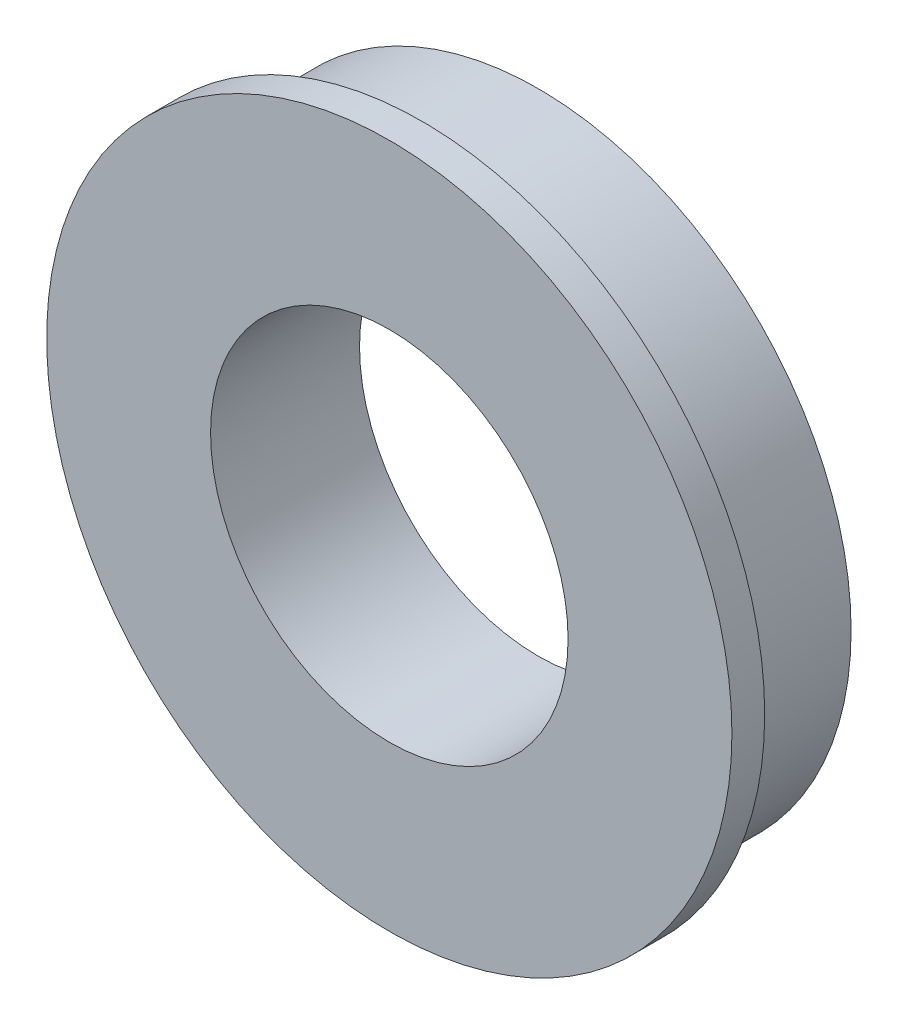
ISO-10303-21;
HEADER;
FILE_DESCRIPTION(('STEP AP214'),'2;1');
FILE_NAME('part.step','',(''),(''),'','','');
FILE_SCHEMA(('AUTOMOTIVE_DESIGN { 1 0 10303 214 1 1 1 1 }'));
ENDSEC;
DATA;
#1=APPLICATION_CONTEXT('core data for automotive mechanical design processes');
#2=APPLICATION_PROTOCOL_DEFINITION('international standard','automotive_design',2000,#1);
#3=PRODUCT_CONTEXT('',#1,'mechanical');
#4=PRODUCT('Part','Part','',(#3));
#5=PRODUCT_RELATED_PRODUCT_CATEGORY('part','',(#4));
#6=PRODUCT_DEFINITION_FORMATION('','',#4);
#7=PRODUCT_DEFINITION_CONTEXT('part definition',#1,'design');
#8=PRODUCT_DEFINITION('design','',#6,#7);
#9=PRODUCT_DEFINITION_SHAPE('','',#8);
#10=(LENGTH_UNIT() NAMED_UNIT(*) SI_UNIT(.MILLI.,.METRE.));
#11=(NAMED_UNIT(*) PLANE_ANGLE_UNIT() SI_UNIT($,.RADIAN.));
#12=(NAMED_UNIT(*) SI_UNIT($,.STERADIAN.) SOLID_ANGLE_UNIT());
#13=UNCERTAINTY_MEASURE_WITH_UNIT(LENGTH_MEASURE(1.E-05),#10,'distance_accuracy_value','');
#14=(GEOMETRIC_REPRESENTATION_CONTEXT(3) GLOBAL_UNCERTAINTY_ASSIGNED_CONTEXT((#13)) GLOBAL_UNIT_ASSIGNED_CONTEXT((#10,
#11,#12)) REPRESENTATION_CONTEXT('',''));
#15=CARTESIAN_POINT('',(0.,0.,0.));
#16=DIRECTION('',(0.,0.,1.));
#17=DIRECTION('',(1.,0.,0.));
#18=AXIS2_PLACEMENT_3D('',#15,#16,#17);
#19=CARTESIAN_POINT('',(0.,11.5,0.));
#20=DIRECTION('',(0.,0.,-1.));
#21=DIRECTION('',(-1.,0.,0.));
#22=AXIS2_PLACEMENT_3D('',#19,#20,#21);
#23=PLANE('',#22);
#24=CARTESIAN_POINT('',(0.,0.,0.));
#25=DIRECTION('',(0.,0.,1.));
#26=DIRECTION('',(1.,0.,0.));
#27=AXIS2_PLACEMENT_3D('',#24,#25,#26);
#28=CIRCLE('',#27,6.);
#29=CARTESIAN_POINT('',(6.,0.,0.));
#30=VERTEX_POINT('',#29);
#31=EDGE_CURVE('E10',#30,#30,#28,.T.);
#32=ORIENTED_EDGE('',*,*,#31,.F.);
#33=EDGE_LOOP('',(#32));
#34=FACE_BOUND('',#33,.T.);
#35=CARTESIAN_POINT('',(0.,0.,0.));
#36=DIRECTION('',(0.,0.,1.));
#37=DIRECTION('',(1.,0.,0.));
#38=AXIS2_PLACEMENT_3D('',#35,#36,#37);
#39=CIRCLE('',#38,11.5);
#40=CARTESIAN_POINT('',(11.5,0.,0.));
#41=VERTEX_POINT('',#40);
#42=EDGE_CURVE('E54',#41,#41,#39,.T.);
#43=ORIENTED_EDGE('',*,*,#42,.T.);
#44=EDGE_LOOP('',(#43));
#45=FACE_BOUND('',#44,.T.);
#46=ADVANCED_FACE('F32',(#34,#45),#23,.F.);
#47=CARTESIAN_POINT('',(0.,0.,0.));
#48=DIRECTION('',(0.,0.,1.));
#49=DIRECTION('',(1.,0.,0.));
#50=AXIS2_PLACEMENT_3D('',#47,#48,#49);
#51=CYLINDRICAL_SURFACE('',#50,6.);
#52=CARTESIAN_POINT('',(0.,0.,-5.));
#53=DIRECTION('',(0.,0.,1.));
#54=DIRECTION('',(1.,0.,0.));
#55=AXIS2_PLACEMENT_3D('',#52,#53,#54);
#56=CIRCLE('',#55,6.);
#57=CARTESIAN_POINT('',(6.,0.,-5.));
#58=VERTEX_POINT('',#57);
#59=EDGE_CURVE('E38',#58,#58,#56,.T.);
#60=ORIENTED_EDGE('',*,*,#59,.F.);
#61=EDGE_LOOP('',(#60));
#62=FACE_BOUND('',#61,.T.);
#63=ORIENTED_EDGE('',*,*,#31,.T.);
#64=EDGE_LOOP('',(#63));
#65=FACE_BOUND('',#64,.T.);
#66=ADVANCED_FACE('F79',(#62,#65),#51,.F.);
#67=CARTESIAN_POINT('',(0.,6.,-5.));
#68=DIRECTION('',(0.,0.,1.));
#69=DIRECTION('',(1.,0.,0.));
#70=AXIS2_PLACEMENT_3D('',#67,#68,#69);
#71=PLANE('',#70);
#72=CARTESIAN_POINT('',(0.,0.,-5.));
#73=DIRECTION('',(0.,0.,1.));
#74=DIRECTION('',(1.,0.,0.));
#75=AXIS2_PLACEMENT_3D('',#72,#73,#74);
#76=CIRCLE('',#75,10.5);
#77=CARTESIAN_POINT('',(10.5,0.,-5.));
#78=VERTEX_POINT('',#77);
#79=EDGE_CURVE('E42',#78,#78,#76,.T.);
#80=ORIENTED_EDGE('',*,*,#79,.F.);
#81=EDGE_LOOP('',(#80));
#82=FACE_BOUND('',#81,.T.);
#83=ORIENTED_EDGE('',*,*,#59,.T.);
#84=EDGE_LOOP('',(#83));
#85=FACE_BOUND('',#84,.T.);
#86=ADVANCED_FACE('F74',(#82,#85),#71,.F.);
#87=CARTESIAN_POINT('',(0.,0.,0.));
#88=DIRECTION('',(0.,0.,1.));
#89=DIRECTION('',(1.,0.,0.));
#90=AXIS2_PLACEMENT_3D('',#87,#88,#89);
#91=CYLINDRICAL_SURFACE('',#90,10.5);
#92=CARTESIAN_POINT('',(0.,0.,-1.1));
#93=DIRECTION('',(0.,0.,1.));
#94=DIRECTION('',(1.,0.,0.));
#95=AXIS2_PLACEMENT_3D('',#92,#93,#94);
#96=CIRCLE('',#95,10.5);
#97=CARTESIAN_POINT('',(10.5,0.,-1.1));
#98=VERTEX_POINT('',#97);
#99=EDGE_CURVE('E46',#98,#98,#96,.T.);
#100=ORIENTED_EDGE('',*,*,#99,.F.);
#101=EDGE_LOOP('',(#100));
#102=FACE_BOUND('',#101,.T.);
#103=ORIENTED_EDGE('',*,*,#79,.T.);
#104=EDGE_LOOP('',(#103));
#105=FACE_BOUND('',#104,.T.);
#106=ADVANCED_FACE('F68',(#102,#105),#91,.T.);
#107=CARTESIAN_POINT('',(0.,10.5,-1.1));
#108=DIRECTION('',(0.,0.,1.));
#109=DIRECTION('',(1.,0.,0.));
#110=AXIS2_PLACEMENT_3D('',#107,#108,#109);
#111=PLANE('',#110);
#112=CARTESIAN_POINT('',(0.,0.,-1.1));
#113=DIRECTION('',(0.,0.,1.));
#114=DIRECTION('',(1.,0.,0.));
#115=AXIS2_PLACEMENT_3D('',#112,#113,#114);
#116=CIRCLE('',#115,11.5);
#117=CARTESIAN_POINT('',(11.5,0.,-1.1));
#118=VERTEX_POINT('',#117);
#119=EDGE_CURVE('E51',#118,#118,#116,.T.);
#120=ORIENTED_EDGE('',*,*,#119,.F.);
#121=EDGE_LOOP('',(#120));
#122=FACE_BOUND('',#121,.T.);
#123=ORIENTED_EDGE('',*,*,#99,.T.);
#124=EDGE_LOOP('',(#123));
#125=FACE_BOUND('',#124,.T.);
#126=ADVANCED_FACE('F62',(#122,#125),#111,.F.);
#127=CARTESIAN_POINT('',(0.,0.,0.));
#128=DIRECTION('',(0.,0.,1.));
#129=DIRECTION('',(1.,0.,0.));
#130=AXIS2_PLACEMENT_3D('',#127,#128,#129);
#131=CYLINDRICAL_SURFACE('',#130,11.5);
#132=ORIENTED_EDGE('',*,*,#42,.F.);
#133=EDGE_LOOP('',(#132));
#134=FACE_BOUND('',#133,.T.);
#135=ORIENTED_EDGE('',*,*,#119,.T.);
#136=EDGE_LOOP('',(#135));
#137=FACE_BOUND('',#136,.T.);
#138=ADVANCED_FACE('F59',(#134,#137),#131,.T.);
#139=CLOSED_SHELL('',(#46,#66,#86,#106,#126,#138));
#140=MANIFOLD_SOLID_BREP('B2',#139);
#141=ADVANCED_BREP_SHAPE_REPRESENTATION('',(#18,#140),#14);
#142=SHAPE_DEFINITION_REPRESENTATION(#9,#141);
ENDSEC;
END-ISO-10303-21;
